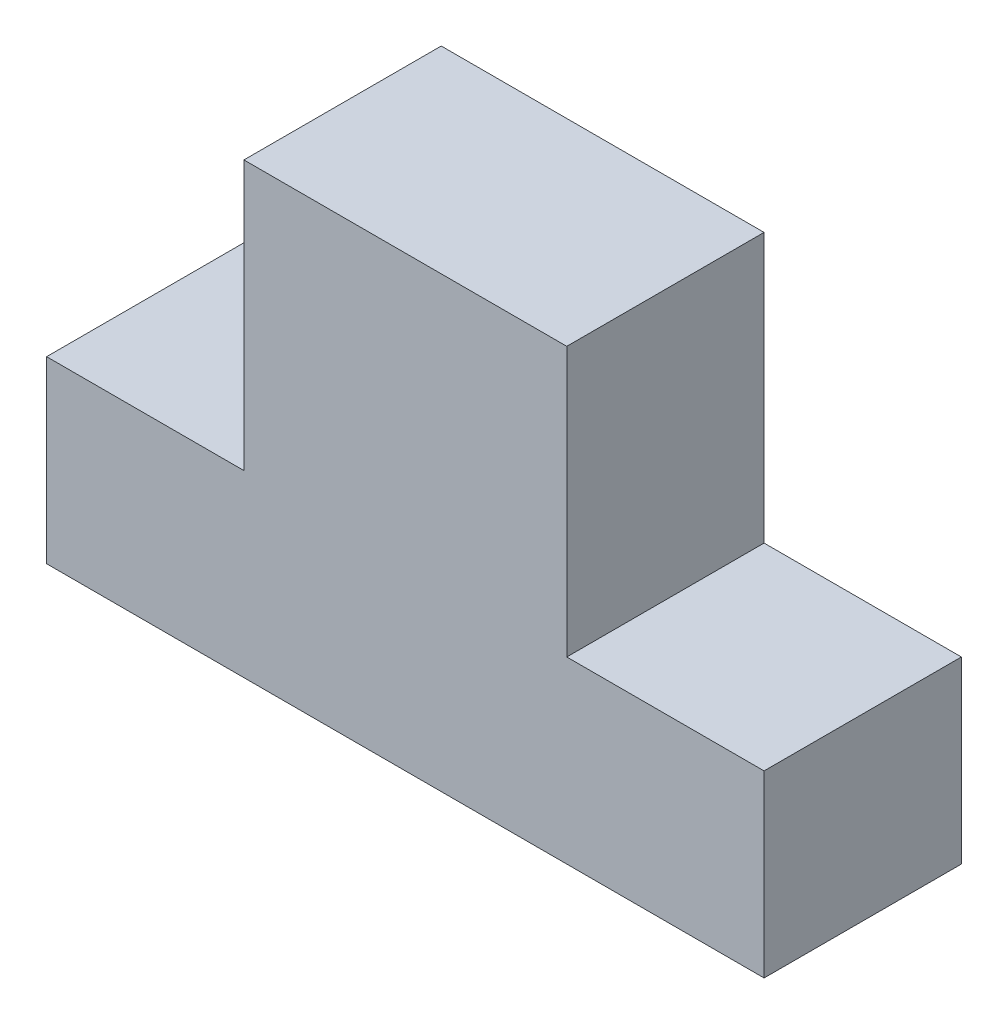
ISO-10303-21;
HEADER;
FILE_DESCRIPTION(('STEP AP214'),'2;1');
FILE_NAME('part.step','',(''),(''),'','','');
FILE_SCHEMA(('AUTOMOTIVE_DESIGN { 1 0 10303 214 1 1 1 1 }'));
ENDSEC;
DATA;
#1=APPLICATION_CONTEXT('core data for automotive mechanical design processes');
#2=APPLICATION_PROTOCOL_DEFINITION('international standard','automotive_design',2000,#1);
#3=PRODUCT_CONTEXT('',#1,'mechanical');
#4=PRODUCT('Part','Part','',(#3));
#5=PRODUCT_RELATED_PRODUCT_CATEGORY('part','',(#4));
#6=PRODUCT_DEFINITION_FORMATION('','',#4);
#7=PRODUCT_DEFINITION_CONTEXT('part definition',#1,'design');
#8=PRODUCT_DEFINITION('design','',#6,#7);
#9=PRODUCT_DEFINITION_SHAPE('','',#8);
#10=(LENGTH_UNIT() NAMED_UNIT(*) SI_UNIT(.MILLI.,.METRE.));
#11=(NAMED_UNIT(*) PLANE_ANGLE_UNIT() SI_UNIT($,.RADIAN.));
#12=(NAMED_UNIT(*) SI_UNIT($,.STERADIAN.) SOLID_ANGLE_UNIT());
#13=UNCERTAINTY_MEASURE_WITH_UNIT(LENGTH_MEASURE(1.E-05),#10,'distance_accuracy_value','');
#14=(GEOMETRIC_REPRESENTATION_CONTEXT(3) GLOBAL_UNCERTAINTY_ASSIGNED_CONTEXT((#13)) GLOBAL_UNIT_ASSIGNED_CONTEXT((#10,
#11,#12)) REPRESENTATION_CONTEXT('',''));
#15=CARTESIAN_POINT('',(0.,0.,0.));
#16=DIRECTION('',(0.,0.,1.));
#17=DIRECTION('',(1.,0.,0.));
#18=AXIS2_PLACEMENT_3D('',#15,#16,#17);
#19=CARTESIAN_POINT('',(-10.,5.,5.5));
#20=DIRECTION('',(1.,0.,0.));
#21=DIRECTION('',(0.,0.,-1.));
#22=AXIS2_PLACEMENT_3D('',#19,#20,#21);
#23=PLANE('',#22);
#24=DIRECTION('',(0.,-1.,0.));
#25=VECTOR('',#24,1.);
#26=CARTESIAN_POINT('',(-10.,5.,0.));
#27=LINE('',#26,#25);
#28=CARTESIAN_POINT('',(-10.,5.,0.));
#29=VERTEX_POINT('',#28);
#30=CARTESIAN_POINT('',(-10.,0.,0.));
#31=VERTEX_POINT('',#30);
#32=EDGE_CURVE('E129',#29,#31,#27,.T.);
#33=ORIENTED_EDGE('',*,*,#32,.T.);
#34=DIRECTION('',(0.,0.,-1.));
#35=VECTOR('',#34,1.);
#36=CARTESIAN_POINT('',(-10.,0.,5.5));
#37=LINE('',#36,#35);
#38=CARTESIAN_POINT('',(-10.,0.,5.5));
#39=VERTEX_POINT('',#38);
#40=EDGE_CURVE('E11',#39,#31,#37,.T.);
#41=ORIENTED_EDGE('',*,*,#40,.F.);
#42=DIRECTION('',(0.,-1.,0.));
#43=VECTOR('',#42,1.);
#44=CARTESIAN_POINT('',(-10.,5.,5.5));
#45=LINE('',#44,#43);
#46=CARTESIAN_POINT('',(-10.,5.,5.5));
#47=VERTEX_POINT('',#46);
#48=EDGE_CURVE('E143',#47,#39,#45,.T.);
#49=ORIENTED_EDGE('',*,*,#48,.F.);
#50=DIRECTION('',(0.,0.,-1.));
#51=VECTOR('',#50,1.);
#52=CARTESIAN_POINT('',(-10.,5.,5.5));
#53=LINE('',#52,#51);
#54=EDGE_CURVE('E125',#47,#29,#53,.T.);
#55=ORIENTED_EDGE('',*,*,#54,.T.);
#56=EDGE_LOOP('',(#33,#41,#49,#55));
#57=FACE_BOUND('',#56,.T.);
#58=ADVANCED_FACE('F33',(#57),#23,.F.);
#59=CARTESIAN_POINT('',(-10.,0.,5.5));
#60=DIRECTION('',(0.,1.,0.));
#61=DIRECTION('',(0.,0.,1.));
#62=AXIS2_PLACEMENT_3D('',#59,#60,#61);
#63=PLANE('',#62);
#64=DIRECTION('',(1.,0.,0.));
#65=VECTOR('',#64,1.);
#66=CARTESIAN_POINT('',(-10.,0.,0.));
#67=LINE('',#66,#65);
#68=CARTESIAN_POINT('',(10.,0.,0.));
#69=VERTEX_POINT('',#68);
#70=EDGE_CURVE('E132',#31,#69,#67,.T.);
#71=ORIENTED_EDGE('',*,*,#70,.T.);
#72=DIRECTION('',(0.,0.,-1.));
#73=VECTOR('',#72,1.);
#74=CARTESIAN_POINT('',(10.,0.,5.5));
#75=LINE('',#74,#73);
#76=CARTESIAN_POINT('',(10.,0.,5.5));
#77=VERTEX_POINT('',#76);
#78=EDGE_CURVE('E41',#77,#69,#75,.T.);
#79=ORIENTED_EDGE('',*,*,#78,.F.);
#80=DIRECTION('',(1.,0.,0.));
#81=VECTOR('',#80,1.);
#82=CARTESIAN_POINT('',(-10.,0.,5.5));
#83=LINE('',#82,#81);
#84=EDGE_CURVE('E92',#39,#77,#83,.T.);
#85=ORIENTED_EDGE('',*,*,#84,.F.);
#86=ORIENTED_EDGE('',*,*,#40,.T.);
#87=EDGE_LOOP('',(#71,#79,#85,#86));
#88=FACE_BOUND('',#87,.T.);
#89=ADVANCED_FACE('F178',(#88),#63,.F.);
#90=CARTESIAN_POINT('',(10.,0.,5.5));
#91=DIRECTION('',(-1.,0.,0.));
#92=DIRECTION('',(0.,0.,1.));
#93=AXIS2_PLACEMENT_3D('',#90,#91,#92);
#94=PLANE('',#93);
#95=DIRECTION('',(0.,1.,0.));
#96=VECTOR('',#95,1.);
#97=CARTESIAN_POINT('',(10.,0.,0.));
#98=LINE('',#97,#96);
#99=CARTESIAN_POINT('',(10.,5.,0.));
#100=VERTEX_POINT('',#99);
#101=EDGE_CURVE('E134',#69,#100,#98,.T.);
#102=ORIENTED_EDGE('',*,*,#101,.T.);
#103=DIRECTION('',(0.,0.,-1.));
#104=VECTOR('',#103,1.);
#105=CARTESIAN_POINT('',(10.,5.,5.5));
#106=LINE('',#105,#104);
#107=CARTESIAN_POINT('',(10.,5.,5.5));
#108=VERTEX_POINT('',#107);
#109=EDGE_CURVE('E150',#108,#100,#106,.T.);
#110=ORIENTED_EDGE('',*,*,#109,.F.);
#111=DIRECTION('',(0.,1.,0.));
#112=VECTOR('',#111,1.);
#113=CARTESIAN_POINT('',(10.,0.,5.5));
#114=LINE('',#113,#112);
#115=EDGE_CURVE('E158',#77,#108,#114,.T.);
#116=ORIENTED_EDGE('',*,*,#115,.F.);
#117=ORIENTED_EDGE('',*,*,#78,.T.);
#118=EDGE_LOOP('',(#102,#110,#116,#117));
#119=FACE_BOUND('',#118,.T.);
#120=ADVANCED_FACE('F156',(#119),#94,.F.);
#121=CARTESIAN_POINT('',(10.,5.,5.5));
#122=DIRECTION('',(0.,-1.,0.));
#123=DIRECTION('',(1.,0.,0.));
#124=AXIS2_PLACEMENT_3D('',#121,#122,#123);
#125=PLANE('',#124);
#126=DIRECTION('',(-1.,0.,0.));
#127=VECTOR('',#126,1.);
#128=CARTESIAN_POINT('',(10.,5.,0.));
#129=LINE('',#128,#127);
#130=CARTESIAN_POINT('',(4.5,5.,0.));
#131=VERTEX_POINT('',#130);
#132=EDGE_CURVE('E136',#100,#131,#129,.T.);
#133=ORIENTED_EDGE('',*,*,#132,.T.);
#134=DIRECTION('',(0.,0.,-1.));
#135=VECTOR('',#134,1.);
#136=CARTESIAN_POINT('',(4.5,5.,5.5));
#137=LINE('',#136,#135);
#138=CARTESIAN_POINT('',(4.5,5.,5.5));
#139=VERTEX_POINT('',#138);
#140=EDGE_CURVE('E147',#139,#131,#137,.T.);
#141=ORIENTED_EDGE('',*,*,#140,.F.);
#142=DIRECTION('',(-1.,0.,0.));
#143=VECTOR('',#142,1.);
#144=CARTESIAN_POINT('',(10.,5.,5.5));
#145=LINE('',#144,#143);
#146=EDGE_CURVE('E170',#108,#139,#145,.T.);
#147=ORIENTED_EDGE('',*,*,#146,.F.);
#148=ORIENTED_EDGE('',*,*,#109,.T.);
#149=EDGE_LOOP('',(#133,#141,#147,#148));
#150=FACE_BOUND('',#149,.T.);
#151=ADVANCED_FACE('F166',(#150),#125,.F.);
#152=CARTESIAN_POINT('',(4.5,5.,5.5));
#153=DIRECTION('',(-1.,0.,0.));
#154=DIRECTION('',(0.,0.,1.));
#155=AXIS2_PLACEMENT_3D('',#152,#153,#154);
#156=PLANE('',#155);
#157=DIRECTION('',(0.,1.,0.));
#158=VECTOR('',#157,1.);
#159=CARTESIAN_POINT('',(4.5,5.,0.));
#160=LINE('',#159,#158);
#161=CARTESIAN_POINT('',(4.5,12.5,0.));
#162=VERTEX_POINT('',#161);
#163=EDGE_CURVE('E138',#131,#162,#160,.T.);
#164=ORIENTED_EDGE('',*,*,#163,.T.);
#165=DIRECTION('',(0.,0.,-1.));
#166=VECTOR('',#165,1.);
#167=CARTESIAN_POINT('',(4.5,12.5,5.5));
#168=LINE('',#167,#166);
#169=CARTESIAN_POINT('',(4.5,12.5,5.5));
#170=VERTEX_POINT('',#169);
#171=EDGE_CURVE('E120',#170,#162,#168,.T.);
#172=ORIENTED_EDGE('',*,*,#171,.F.);
#173=DIRECTION('',(0.,1.,0.));
#174=VECTOR('',#173,1.);
#175=CARTESIAN_POINT('',(4.5,5.,5.5));
#176=LINE('',#175,#174);
#177=EDGE_CURVE('E111',#139,#170,#176,.T.);
#178=ORIENTED_EDGE('',*,*,#177,.F.);
#179=ORIENTED_EDGE('',*,*,#140,.T.);
#180=EDGE_LOOP('',(#164,#172,#178,#179));
#181=FACE_BOUND('',#180,.T.);
#182=ADVANCED_FACE('F169',(#181),#156,.F.);
#183=CARTESIAN_POINT('',(4.5,12.5,5.5));
#184=DIRECTION('',(0.,-1.,0.));
#185=DIRECTION('',(1.,0.,0.));
#186=AXIS2_PLACEMENT_3D('',#183,#184,#185);
#187=PLANE('',#186);
#188=DIRECTION('',(-1.,0.,0.));
#189=VECTOR('',#188,1.);
#190=CARTESIAN_POINT('',(4.5,12.5,0.));
#191=LINE('',#190,#189);
#192=CARTESIAN_POINT('',(-4.5,12.5,0.));
#193=VERTEX_POINT('',#192);
#194=EDGE_CURVE('E119',#162,#193,#191,.T.);
#195=ORIENTED_EDGE('',*,*,#194,.T.);
#196=DIRECTION('',(0.,0.,-1.));
#197=VECTOR('',#196,1.);
#198=CARTESIAN_POINT('',(-4.5,12.5,5.5));
#199=LINE('',#198,#197);
#200=CARTESIAN_POINT('',(-4.5,12.5,5.5));
#201=VERTEX_POINT('',#200);
#202=EDGE_CURVE('E116',#201,#193,#199,.T.);
#203=ORIENTED_EDGE('',*,*,#202,.F.);
#204=DIRECTION('',(-1.,0.,0.));
#205=VECTOR('',#204,1.);
#206=CARTESIAN_POINT('',(4.5,12.5,5.5));
#207=LINE('',#206,#205);
#208=EDGE_CURVE('E105',#170,#201,#207,.T.);
#209=ORIENTED_EDGE('',*,*,#208,.F.);
#210=ORIENTED_EDGE('',*,*,#171,.T.);
#211=EDGE_LOOP('',(#195,#203,#209,#210));
#212=FACE_BOUND('',#211,.T.);
#213=ADVANCED_FACE('F117',(#212),#187,.F.);
#214=CARTESIAN_POINT('',(-4.5,12.5,5.5));
#215=DIRECTION('',(1.,0.,0.));
#216=DIRECTION('',(0.,1.,0.));
#217=AXIS2_PLACEMENT_3D('',#214,#215,#216);
#218=PLANE('',#217);
#219=DIRECTION('',(0.,-1.,0.));
#220=VECTOR('',#219,1.);
#221=CARTESIAN_POINT('',(-4.5,12.5,0.));
#222=LINE('',#221,#220);
#223=CARTESIAN_POINT('',(-4.5,5.,0.));
#224=VERTEX_POINT('',#223);
#225=EDGE_CURVE('E78',#193,#224,#222,.T.);
#226=ORIENTED_EDGE('',*,*,#225,.T.);
#227=DIRECTION('',(0.,0.,-1.));
#228=VECTOR('',#227,1.);
#229=CARTESIAN_POINT('',(-4.5,5.,5.5));
#230=LINE('',#229,#228);
#231=CARTESIAN_POINT('',(-4.5,5.,5.5));
#232=VERTEX_POINT('',#231);
#233=EDGE_CURVE('E121',#232,#224,#230,.T.);
#234=ORIENTED_EDGE('',*,*,#233,.F.);
#235=DIRECTION('',(0.,-1.,0.));
#236=VECTOR('',#235,1.);
#237=CARTESIAN_POINT('',(-4.5,12.5,5.5));
#238=LINE('',#237,#236);
#239=EDGE_CURVE('E109',#201,#232,#238,.T.);
#240=ORIENTED_EDGE('',*,*,#239,.F.);
#241=ORIENTED_EDGE('',*,*,#202,.T.);
#242=EDGE_LOOP('',(#226,#234,#240,#241));
#243=FACE_BOUND('',#242,.T.);
#244=ADVANCED_FACE('F123',(#243),#218,.F.);
#245=CARTESIAN_POINT('',(-4.5,5.,5.5));
#246=DIRECTION('',(0.,-1.,0.));
#247=DIRECTION('',(0.,0.,-1.));
#248=AXIS2_PLACEMENT_3D('',#245,#246,#247);
#249=PLANE('',#248);
#250=DIRECTION('',(-1.,0.,0.));
#251=VECTOR('',#250,1.);
#252=CARTESIAN_POINT('',(-4.5,5.,0.));
#253=LINE('',#252,#251);
#254=EDGE_CURVE('E84',#224,#29,#253,.T.);
#255=ORIENTED_EDGE('',*,*,#254,.T.);
#256=ORIENTED_EDGE('',*,*,#54,.F.);
#257=DIRECTION('',(-1.,0.,0.));
#258=VECTOR('',#257,1.);
#259=CARTESIAN_POINT('',(-4.5,5.,5.5));
#260=LINE('',#259,#258);
#261=EDGE_CURVE('E49',#232,#47,#260,.T.);
#262=ORIENTED_EDGE('',*,*,#261,.F.);
#263=ORIENTED_EDGE('',*,*,#233,.T.);
#264=EDGE_LOOP('',(#255,#256,#262,#263));
#265=FACE_BOUND('',#264,.T.);
#266=ADVANCED_FACE('F194',(#265),#249,.F.);
#267=CARTESIAN_POINT('',(0.,0.,5.5));
#268=DIRECTION('',(0.,0.,1.));
#269=DIRECTION('',(1.,0.,0.));
#270=AXIS2_PLACEMENT_3D('',#267,#268,#269);
#271=PLANE('',#270);
#272=ORIENTED_EDGE('',*,*,#48,.T.);
#273=ORIENTED_EDGE('',*,*,#84,.T.);
#274=ORIENTED_EDGE('',*,*,#115,.T.);
#275=ORIENTED_EDGE('',*,*,#146,.T.);
#276=ORIENTED_EDGE('',*,*,#177,.T.);
#277=ORIENTED_EDGE('',*,*,#208,.T.);
#278=ORIENTED_EDGE('',*,*,#239,.T.);
#279=ORIENTED_EDGE('',*,*,#261,.T.);
#280=EDGE_LOOP('',(#272,#273,#274,#275,#276,#277,#278,#279));
#281=FACE_BOUND('',#280,.T.);
#282=ADVANCED_FACE('F107',(#281),#271,.T.);
#283=CARTESIAN_POINT('',(0.,0.,0.));
#284=DIRECTION('',(0.,0.,1.));
#285=DIRECTION('',(1.,0.,0.));
#286=AXIS2_PLACEMENT_3D('',#283,#284,#285);
#287=PLANE('',#286);
#288=ORIENTED_EDGE('',*,*,#32,.F.);
#289=ORIENTED_EDGE('',*,*,#254,.F.);
#290=ORIENTED_EDGE('',*,*,#225,.F.);
#291=ORIENTED_EDGE('',*,*,#194,.F.);
#292=ORIENTED_EDGE('',*,*,#163,.F.);
#293=ORIENTED_EDGE('',*,*,#132,.F.);
#294=ORIENTED_EDGE('',*,*,#101,.F.);
#295=ORIENTED_EDGE('',*,*,#70,.F.);
#296=EDGE_LOOP('',(#288,#289,#290,#291,#292,#293,#294,#295));
#297=FACE_BOUND('',#296,.T.);
#298=ADVANCED_FACE('F162',(#297),#287,.F.);
#299=CLOSED_SHELL('',(#58,#89,#120,#151,#182,#213,#244,#266,#282,#298));
#300=MANIFOLD_SOLID_BREP('B2',#299);
#301=ADVANCED_BREP_SHAPE_REPRESENTATION('',(#18,#300),#14);
#302=SHAPE_DEFINITION_REPRESENTATION(#9,#301);
ENDSEC;
END-ISO-10303-21;
